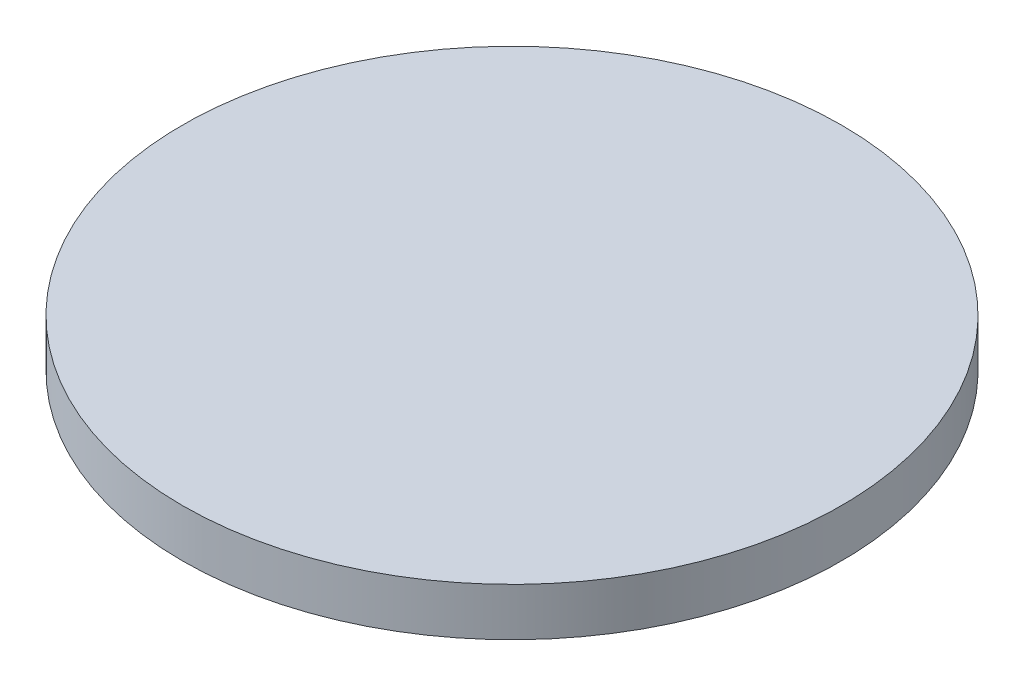
ISO-10303-21;
HEADER;
FILE_DESCRIPTION(('STEP AP214'),'2;1');
FILE_NAME('part.step','',(''),(''),'','','');
FILE_SCHEMA(('AUTOMOTIVE_DESIGN { 1 0 10303 214 1 1 1 1 }'));
ENDSEC;
DATA;
#1=APPLICATION_CONTEXT('core data for automotive mechanical design processes');
#2=APPLICATION_PROTOCOL_DEFINITION('international standard','automotive_design',2000,#1);
#3=PRODUCT_CONTEXT('',#1,'mechanical');
#4=PRODUCT('Part','Part','',(#3));
#5=PRODUCT_RELATED_PRODUCT_CATEGORY('part','',(#4));
#6=PRODUCT_DEFINITION_FORMATION('','',#4);
#7=PRODUCT_DEFINITION_CONTEXT('part definition',#1,'design');
#8=PRODUCT_DEFINITION('design','',#6,#7);
#9=PRODUCT_DEFINITION_SHAPE('','',#8);
#10=(LENGTH_UNIT() NAMED_UNIT(*) SI_UNIT(.MILLI.,.METRE.));
#11=(NAMED_UNIT(*) PLANE_ANGLE_UNIT() SI_UNIT($,.RADIAN.));
#12=(NAMED_UNIT(*) SI_UNIT($,.STERADIAN.) SOLID_ANGLE_UNIT());
#13=UNCERTAINTY_MEASURE_WITH_UNIT(LENGTH_MEASURE(1.E-05),#10,'distance_accuracy_value','');
#14=(GEOMETRIC_REPRESENTATION_CONTEXT(3) GLOBAL_UNCERTAINTY_ASSIGNED_CONTEXT((#13)) GLOBAL_UNIT_ASSIGNED_CONTEXT((#10,
#11,#12)) REPRESENTATION_CONTEXT('',''));
#15=CARTESIAN_POINT('',(0.,0.,0.));
#16=DIRECTION('',(0.,0.,1.));
#17=DIRECTION('',(1.,0.,0.));
#18=AXIS2_PLACEMENT_3D('',#15,#16,#17);
#19=CARTESIAN_POINT('',(0.,2.032,0.));
#20=DIRECTION('',(0.,-1.,0.));
#21=DIRECTION('',(0.,0.,-1.));
#22=AXIS2_PLACEMENT_3D('',#19,#20,#21);
#23=CYLINDRICAL_SURFACE('',#22,13.97);
#24=CARTESIAN_POINT('',(0.,2.032,0.));
#25=DIRECTION('',(0.,1.,0.));
#26=DIRECTION('',(0.,0.,1.));
#27=AXIS2_PLACEMENT_3D('',#24,#25,#26);
#28=CIRCLE('',#27,13.97);
#29=CARTESIAN_POINT('',(0.,2.032,13.97));
#30=VERTEX_POINT('',#29);
#31=EDGE_CURVE('E10',#30,#30,#28,.T.);
#32=ORIENTED_EDGE('',*,*,#31,.F.);
#33=EDGE_LOOP('',(#32));
#34=FACE_BOUND('',#33,.T.);
#35=CARTESIAN_POINT('',(0.,0.,0.));
#36=DIRECTION('',(0.,1.,0.));
#37=DIRECTION('',(0.,0.,1.));
#38=AXIS2_PLACEMENT_3D('',#35,#36,#37);
#39=CIRCLE('',#38,13.97);
#40=CARTESIAN_POINT('',(0.,0.,13.97));
#41=VERTEX_POINT('',#40);
#42=EDGE_CURVE('E34',#41,#41,#39,.T.);
#43=ORIENTED_EDGE('',*,*,#42,.T.);
#44=EDGE_LOOP('',(#43));
#45=FACE_BOUND('',#44,.T.);
#46=ADVANCED_FACE('F31',(#34,#45),#23,.T.);
#47=CARTESIAN_POINT('',(0.,2.032,0.));
#48=DIRECTION('',(0.,1.,0.));
#49=DIRECTION('',(0.,0.,1.));
#50=AXIS2_PLACEMENT_3D('',#47,#48,#49);
#51=PLANE('',#50);
#52=ORIENTED_EDGE('',*,*,#31,.T.);
#53=EDGE_LOOP('',(#52));
#54=FACE_BOUND('',#53,.T.);
#55=ADVANCED_FACE('F46',(#54),#51,.T.);
#56=CARTESIAN_POINT('',(0.,0.,0.));
#57=DIRECTION('',(0.,1.,0.));
#58=DIRECTION('',(0.,0.,1.));
#59=AXIS2_PLACEMENT_3D('',#56,#57,#58);
#60=PLANE('',#59);
#61=ORIENTED_EDGE('',*,*,#42,.F.);
#62=EDGE_LOOP('',(#61));
#63=FACE_BOUND('',#62,.T.);
#64=ADVANCED_FACE('F44',(#63),#60,.F.);
#65=CLOSED_SHELL('',(#46,#55,#64));
#66=MANIFOLD_SOLID_BREP('B2',#65);
#67=ADVANCED_BREP_SHAPE_REPRESENTATION('',(#18,#66),#14);
#68=SHAPE_DEFINITION_REPRESENTATION(#9,#67);
ENDSEC;
END-ISO-10303-21;
